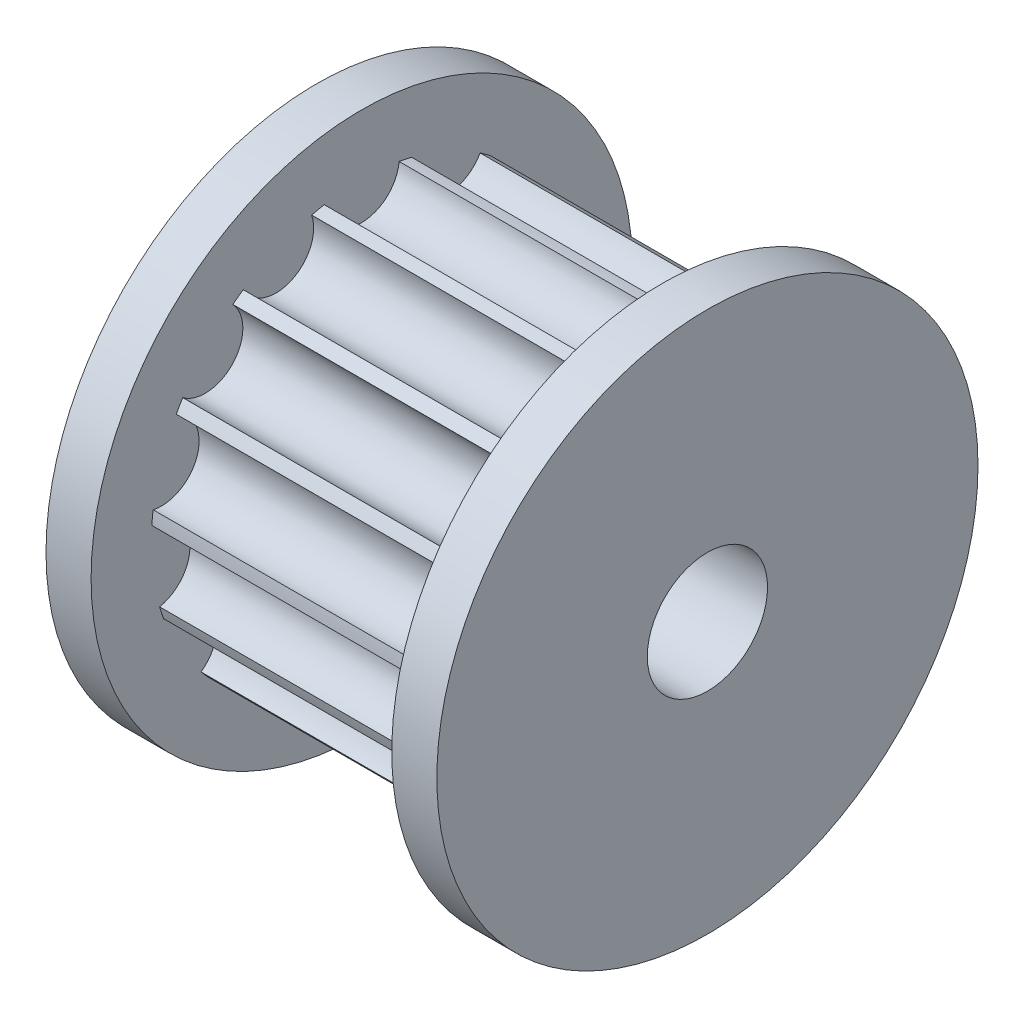
ISO-10303-21;
HEADER;
FILE_DESCRIPTION(('STEP AP214'),'2;1');
FILE_NAME('part.step','',(''),(''),'','','');
FILE_SCHEMA(('AUTOMOTIVE_DESIGN { 1 0 10303 214 1 1 1 1 }'));
ENDSEC;
DATA;
#1=APPLICATION_CONTEXT('core data for automotive mechanical design processes');
#2=APPLICATION_PROTOCOL_DEFINITION('international standard','automotive_design',2000,#1);
#3=PRODUCT_CONTEXT('',#1,'mechanical');
#4=PRODUCT('Part','Part','',(#3));
#5=PRODUCT_RELATED_PRODUCT_CATEGORY('part','',(#4));
#6=PRODUCT_DEFINITION_FORMATION('','',#4);
#7=PRODUCT_DEFINITION_CONTEXT('part definition',#1,'design');
#8=PRODUCT_DEFINITION('design','',#6,#7);
#9=PRODUCT_DEFINITION_SHAPE('','',#8);
#10=(LENGTH_UNIT() NAMED_UNIT(*) SI_UNIT(.MILLI.,.METRE.));
#11=(NAMED_UNIT(*) PLANE_ANGLE_UNIT() SI_UNIT($,.RADIAN.));
#12=(NAMED_UNIT(*) SI_UNIT($,.STERADIAN.) SOLID_ANGLE_UNIT());
#13=UNCERTAINTY_MEASURE_WITH_UNIT(LENGTH_MEASURE(1.E-05),#10,'distance_accuracy_value','');
#14=(GEOMETRIC_REPRESENTATION_CONTEXT(3) GLOBAL_UNCERTAINTY_ASSIGNED_CONTEXT((#13)) GLOBAL_UNIT_ASSIGNED_CONTEXT((#10,
#11,#12)) REPRESENTATION_CONTEXT('',''));
#15=CARTESIAN_POINT('',(0.,0.,0.));
#16=DIRECTION('',(0.,0.,1.));
#17=DIRECTION('',(1.,0.,0.));
#18=AXIS2_PLACEMENT_3D('',#15,#16,#17);
#19=CARTESIAN_POINT('',(-48.9644918561277,1.84719136614903,0.));
#20=DIRECTION('',(-1.,0.,0.));
#21=DIRECTION('',(0.,0.,1.));
#22=AXIS2_PLACEMENT_3D('',#19,#20,#21);
#23=CYLINDRICAL_SURFACE('',#22,7.);
#24=CARTESIAN_POINT('',(-27.3637349174757,1.84719136614903,0.));
#25=DIRECTION('',(-1.,0.,0.));
#26=DIRECTION('',(0.,0.,1.));
#27=AXIS2_PLACEMENT_3D('',#24,#25,#26);
#28=CIRCLE('',#27,7.);
#29=CARTESIAN_POINT('',(-27.3637349174757,-2.99383843144402,5.05612801448067));
#30=VERTEX_POINT('',#29);
#31=CARTESIAN_POINT('',(-27.3637349174757,-2.6752132446615,5.3430194212748));
#32=VERTEX_POINT('',#31);
#33=EDGE_CURVE('E316',#30,#32,#28,.T.);
#34=ORIENTED_EDGE('',*,*,#33,.F.);
#35=DIRECTION('',(-1.,0.,0.));
#36=VECTOR('',#35,1.);
#37=CARTESIAN_POINT('',(-10.3637349174757,-2.99383843144402,5.05612801448067));
#38=LINE('',#37,#36);
#39=CARTESIAN_POINT('',(-17.3637349174757,-2.99383843144402,5.05612801448067));
#40=VERTEX_POINT('',#39);
#41=EDGE_CURVE('E263',#40,#30,#38,.T.);
#42=ORIENTED_EDGE('',*,*,#41,.F.);
#43=CARTESIAN_POINT('',(-17.3637349174757,1.84719136614903,0.));
#44=DIRECTION('',(-1.,0.,0.));
#45=DIRECTION('',(0.,0.,1.));
#46=AXIS2_PLACEMENT_3D('',#43,#44,#45);
#47=CIRCLE('',#46,7.);
#48=CARTESIAN_POINT('',(-17.3637349174757,-2.6752132446615,5.3430194212748));
#49=VERTEX_POINT('',#48);
#50=EDGE_CURVE('E253',#40,#49,#47,.T.);
#51=ORIENTED_EDGE('',*,*,#50,.T.);
#52=DIRECTION('',(-1.,0.,0.));
#53=VECTOR('',#52,1.);
#54=CARTESIAN_POINT('',(-10.3637349174757,-2.6752132446615,5.3430194212748));
#55=LINE('',#54,#53);
#56=EDGE_CURVE('E486',#49,#32,#55,.T.);
#57=ORIENTED_EDGE('',*,*,#56,.T.);
#58=EDGE_LOOP('',(#34,#42,#51,#57));
#59=FACE_BOUND('',#58,.T.);
#60=ADVANCED_FACE('F39',(#59),#23,.T.);
#61=CARTESIAN_POINT('',(-17.3637349174757,-4.63182195132596,2.6499785719854));
#62=VERTEX_POINT('',#61);
#63=CARTESIAN_POINT('',(-17.3637349174757,-4.457432606977,3.04166345237019));
#64=VERTEX_POINT('',#63);
#65=EDGE_CURVE('E241',#62,#64,#47,.T.);
#66=ORIENTED_EDGE('',*,*,#65,.T.);
#67=DIRECTION('',(-1.,0.,0.));
#68=VECTOR('',#67,1.);
#69=CARTESIAN_POINT('',(-10.3637349174757,-4.457432606977,3.04166345237019));
#70=LINE('',#69,#68);
#71=CARTESIAN_POINT('',(-27.3637349174757,-4.457432606977,3.04166345237019));
#72=VERTEX_POINT('',#71);
#73=EDGE_CURVE('E245',#64,#72,#70,.T.);
#74=ORIENTED_EDGE('',*,*,#73,.T.);
#75=CARTESIAN_POINT('',(-27.3637349174757,-4.63182195132596,2.6499785719854));
#76=VERTEX_POINT('',#75);
#77=EDGE_CURVE('E320',#76,#72,#28,.T.);
#78=ORIENTED_EDGE('',*,*,#77,.F.);
#79=DIRECTION('',(-1.,0.,0.));
#80=VECTOR('',#79,1.);
#81=CARTESIAN_POINT('',(-10.3637349174757,-4.63182195132596,2.6499785719854));
#82=LINE('',#81,#80);
#83=EDGE_CURVE('E247',#62,#76,#82,.T.);
#84=ORIENTED_EDGE('',*,*,#83,.F.);
#85=EDGE_LOOP('',(#66,#74,#78,#84));
#86=FACE_BOUND('',#85,.T.);
#87=ADVANCED_FACE('F243',(#86),#23,.T.);
#88=CARTESIAN_POINT('',(-17.3637349174757,-5.14952520862831,-0.214376239905701));
#89=VERTEX_POINT('',#88);
#90=CARTESIAN_POINT('',(-17.3637349174757,-5.14952520862831,0.214376239905796));
#91=VERTEX_POINT('',#90);
#92=EDGE_CURVE('E252',#89,#91,#47,.T.);
#93=ORIENTED_EDGE('',*,*,#92,.T.);
#94=DIRECTION('',(-1.,0.,0.));
#95=VECTOR('',#94,1.);
#96=CARTESIAN_POINT('',(-10.3637349174757,-5.14952520862831,0.214376239905796));
#97=LINE('',#96,#95);
#98=CARTESIAN_POINT('',(-27.3637349174757,-5.14952520862831,0.214376239905795));
#99=VERTEX_POINT('',#98);
#100=EDGE_CURVE('E476',#91,#99,#97,.T.);
#101=ORIENTED_EDGE('',*,*,#100,.T.);
#102=CARTESIAN_POINT('',(-27.3637349174757,-5.14952520862831,-0.214376239905702));
#103=VERTEX_POINT('',#102);
#104=EDGE_CURVE('E324',#103,#99,#28,.T.);
#105=ORIENTED_EDGE('',*,*,#104,.F.);
#106=DIRECTION('',(-1.,0.,0.));
#107=VECTOR('',#106,1.);
#108=CARTESIAN_POINT('',(-10.3637349174757,-5.14952520862831,-0.214376239905701));
#109=LINE('',#108,#107);
#110=EDGE_CURVE('E463',#89,#103,#109,.T.);
#111=ORIENTED_EDGE('',*,*,#110,.F.);
#112=EDGE_LOOP('',(#93,#101,#105,#111));
#113=FACE_BOUND('',#112,.T.);
#114=ADVANCED_FACE('F467',(#113),#23,.T.);
#115=CARTESIAN_POINT('',(-17.3637349174757,-4.45743260697704,-3.04166345237011));
#116=VERTEX_POINT('',#115);
#117=CARTESIAN_POINT('',(-17.3637349174757,-4.631821951326,-2.64997857198531));
#118=VERTEX_POINT('',#117);
#119=EDGE_CURVE('E457',#116,#118,#47,.T.);
#120=ORIENTED_EDGE('',*,*,#119,.T.);
#121=DIRECTION('',(-1.,0.,0.));
#122=VECTOR('',#121,1.);
#123=CARTESIAN_POINT('',(-10.3637349174757,-4.631821951326,-2.64997857198531));
#124=LINE('',#123,#122);
#125=CARTESIAN_POINT('',(-27.3637349174757,-4.631821951326,-2.64997857198531));
#126=VERTEX_POINT('',#125);
#127=EDGE_CURVE('E465',#118,#126,#124,.T.);
#128=ORIENTED_EDGE('',*,*,#127,.T.);
#129=CARTESIAN_POINT('',(-27.3637349174757,-4.45743260697705,-3.04166345237011));
#130=VERTEX_POINT('',#129);
#131=EDGE_CURVE('E326',#130,#126,#28,.T.);
#132=ORIENTED_EDGE('',*,*,#131,.F.);
#133=DIRECTION('',(-1.,0.,0.));
#134=VECTOR('',#133,1.);
#135=CARTESIAN_POINT('',(-10.3637349174757,-4.45743260697704,-3.04166345237011));
#136=LINE('',#135,#134);
#137=EDGE_CURVE('E558',#116,#130,#136,.T.);
#138=ORIENTED_EDGE('',*,*,#137,.F.);
#139=EDGE_LOOP('',(#120,#128,#132,#138));
#140=FACE_BOUND('',#139,.T.);
#141=ADVANCED_FACE('F565',(#140),#23,.T.);
#142=CARTESIAN_POINT('',(-17.3637349174757,-2.67521324466158,-5.34301942127474));
#143=VERTEX_POINT('',#142);
#144=CARTESIAN_POINT('',(-17.3637349174757,-2.99383843144409,-5.0561280144806));
#145=VERTEX_POINT('',#144);
#146=EDGE_CURVE('E507',#143,#145,#47,.T.);
#147=ORIENTED_EDGE('',*,*,#146,.T.);
#148=DIRECTION('',(-1.,0.,0.));
#149=VECTOR('',#148,1.);
#150=CARTESIAN_POINT('',(-10.3637349174757,-2.99383843144409,-5.0561280144806));
#151=LINE('',#150,#149);
#152=CARTESIAN_POINT('',(-27.3637349174757,-2.99383843144409,-5.05612801448061));
#153=VERTEX_POINT('',#152);
#154=EDGE_CURVE('E393',#145,#153,#151,.T.);
#155=ORIENTED_EDGE('',*,*,#154,.T.);
#156=CARTESIAN_POINT('',(-27.3637349174757,-2.67521324466157,-5.34301942127474));
#157=VERTEX_POINT('',#156);
#158=EDGE_CURVE('E330',#157,#153,#28,.T.);
#159=ORIENTED_EDGE('',*,*,#158,.F.);
#160=DIRECTION('',(-1.,0.,0.));
#161=VECTOR('',#160,1.);
#162=CARTESIAN_POINT('',(-10.3637349174757,-2.67521324466158,-5.34301942127474));
#163=LINE('',#162,#161);
#164=EDGE_CURVE('E392',#143,#157,#163,.T.);
#165=ORIENTED_EDGE('',*,*,#164,.F.);
#166=EDGE_LOOP('',(#147,#155,#159,#165));
#167=FACE_BOUND('',#166,.T.);
#168=ADVANCED_FACE('F567',(#167),#23,.T.);
#169=CARTESIAN_POINT('',(-17.3637349174757,-0.111029040380856,-6.72051879243336));
#170=VERTEX_POINT('',#169);
#171=CARTESIAN_POINT('',(-17.3637349174757,-0.518796880183285,-6.5880269897912));
#172=VERTEX_POINT('',#171);
#173=EDGE_CURVE('E503',#170,#172,#47,.T.);
#174=ORIENTED_EDGE('',*,*,#173,.T.);
#175=DIRECTION('',(-1.,0.,0.));
#176=VECTOR('',#175,1.);
#177=CARTESIAN_POINT('',(-10.3637349174757,-0.518796880183285,-6.5880269897912));
#178=LINE('',#177,#176);
#179=CARTESIAN_POINT('',(-27.3637349174757,-0.518796880183285,-6.5880269897912));
#180=VERTEX_POINT('',#179);
#181=EDGE_CURVE('E382',#172,#180,#178,.T.);
#182=ORIENTED_EDGE('',*,*,#181,.T.);
#183=CARTESIAN_POINT('',(-27.3637349174757,-0.111029040380856,-6.72051879243336));
#184=VERTEX_POINT('',#183);
#185=EDGE_CURVE('E334',#184,#180,#28,.T.);
#186=ORIENTED_EDGE('',*,*,#185,.F.);
#187=DIRECTION('',(-1.,0.,0.));
#188=VECTOR('',#187,1.);
#189=CARTESIAN_POINT('',(-10.3637349174757,-0.111029040380856,-6.72051879243336));
#190=LINE('',#189,#188);
#191=EDGE_CURVE('E381',#170,#184,#190,.T.);
#192=ORIENTED_EDGE('',*,*,#191,.F.);
#193=EDGE_LOOP('',(#174,#182,#186,#192));
#194=FACE_BOUND('',#193,.T.);
#195=ADVANCED_FACE('F572',(#194),#23,.T.);
#196=CARTESIAN_POINT('',(-17.3637349174757,2.79174926206279,-6.93597941038373));
#197=VERTEX_POINT('',#196);
#198=CARTESIAN_POINT('',(-17.3637349174757,2.36534553319681,-6.98079624822061));
#199=VERTEX_POINT('',#198);
#200=EDGE_CURVE('E498',#197,#199,#47,.T.);
#201=ORIENTED_EDGE('',*,*,#200,.T.);
#202=DIRECTION('',(-1.,0.,0.));
#203=VECTOR('',#202,1.);
#204=CARTESIAN_POINT('',(-10.3637349174757,2.36534553319681,-6.98079624822061));
#205=LINE('',#204,#203);
#206=CARTESIAN_POINT('',(-27.3637349174757,2.36534553319681,-6.98079624822061));
#207=VERTEX_POINT('',#206);
#208=EDGE_CURVE('E363',#199,#207,#205,.T.);
#209=ORIENTED_EDGE('',*,*,#208,.T.);
#210=CARTESIAN_POINT('',(-27.3637349174757,2.79174926206279,-6.93597941038373));
#211=VERTEX_POINT('',#210);
#212=EDGE_CURVE('E338',#211,#207,#28,.T.);
#213=ORIENTED_EDGE('',*,*,#212,.F.);
#214=DIRECTION('',(-1.,0.,0.));
#215=VECTOR('',#214,1.);
#216=CARTESIAN_POINT('',(-10.3637349174757,2.79174926206279,-6.93597941038373));
#217=LINE('',#216,#215);
#218=EDGE_CURVE('E361',#197,#211,#217,.T.);
#219=ORIENTED_EDGE('',*,*,#218,.F.);
#220=EDGE_LOOP('',(#201,#209,#213,#219));
#221=FACE_BOUND('',#220,.T.);
#222=ADVANCED_FACE('F750',(#221),#23,.T.);
#223=CARTESIAN_POINT('',(-17.3637349174757,5.53120492326384,-5.95214617688395));
#224=VERTEX_POINT('',#223);
#225=CARTESIAN_POINT('',(-17.3637349174757,5.15989438381151,-6.1665224167897));
#226=VERTEX_POINT('',#225);
#227=EDGE_CURVE('E367',#224,#226,#47,.T.);
#228=ORIENTED_EDGE('',*,*,#227,.T.);
#229=DIRECTION('',(-1.,0.,0.));
#230=VECTOR('',#229,1.);
#231=CARTESIAN_POINT('',(-10.3637349174757,5.15989438381151,-6.1665224167897));
#232=LINE('',#231,#230);
#233=CARTESIAN_POINT('',(-27.3637349174757,5.15989438381152,-6.1665224167897));
#234=VERTEX_POINT('',#233);
#235=EDGE_CURVE('E358',#226,#234,#232,.T.);
#236=ORIENTED_EDGE('',*,*,#235,.T.);
#237=CARTESIAN_POINT('',(-27.3637349174757,5.53120492326385,-5.95214617688395));
#238=VERTEX_POINT('',#237);
#239=EDGE_CURVE('E299',#238,#234,#28,.T.);
#240=ORIENTED_EDGE('',*,*,#239,.F.);
#241=DIRECTION('',(-1.,0.,0.));
#242=VECTOR('',#241,1.);
#243=CARTESIAN_POINT('',(-10.3637349174757,5.53120492326384,-5.95214617688395));
#244=LINE('',#243,#242);
#245=EDGE_CURVE('E373',#224,#238,#244,.T.);
#246=ORIENTED_EDGE('',*,*,#245,.F.);
#247=EDGE_LOOP('',(#228,#236,#240,#246));
#248=FACE_BOUND('',#247,.T.);
#249=ADVANCED_FACE('F365',(#248),#23,.T.);
#250=CARTESIAN_POINT('',(-27.3637349174757,-0.518796880183193,6.58802698979124));
#251=VERTEX_POINT('',#250);
#252=CARTESIAN_POINT('',(-27.3637349174757,-0.111029040380764,6.72051879243339));
#253=VERTEX_POINT('',#252);
#254=EDGE_CURVE('E312',#251,#253,#28,.T.);
#255=ORIENTED_EDGE('',*,*,#254,.F.);
#256=DIRECTION('',(-1.,0.,0.));
#257=VECTOR('',#256,1.);
#258=CARTESIAN_POINT('',(-10.3637349174757,-0.518796880183194,6.58802698979124));
#259=LINE('',#258,#257);
#260=CARTESIAN_POINT('',(-17.3637349174757,-0.518796880183194,6.58802698979124));
#261=VERTEX_POINT('',#260);
#262=EDGE_CURVE('E697',#261,#251,#259,.T.);
#263=ORIENTED_EDGE('',*,*,#262,.F.);
#264=CARTESIAN_POINT('',(-17.3637349174757,-0.111029040380764,6.72051879243339));
#265=VERTEX_POINT('',#264);
#266=EDGE_CURVE('E523',#261,#265,#47,.T.);
#267=ORIENTED_EDGE('',*,*,#266,.T.);
#268=DIRECTION('',(-1.,0.,0.));
#269=VECTOR('',#268,1.);
#270=CARTESIAN_POINT('',(-10.3637349174757,-0.111029040380764,6.72051879243339));
#271=LINE('',#270,#269);
#272=EDGE_CURVE('E698',#265,#253,#271,.T.);
#273=ORIENTED_EDGE('',*,*,#272,.T.);
#274=EDGE_LOOP('',(#255,#263,#267,#273));
#275=FACE_BOUND('',#274,.T.);
#276=ADVANCED_FACE('F744',(#275),#23,.T.);
#277=CARTESIAN_POINT('',(-27.3637349174757,2.36534553319691,6.98079624822061));
#278=VERTEX_POINT('',#277);
#279=CARTESIAN_POINT('',(-27.3637349174757,2.79174926206288,6.93597941038371));
#280=VERTEX_POINT('',#279);
#281=EDGE_CURVE('E308',#278,#280,#28,.T.);
#282=ORIENTED_EDGE('',*,*,#281,.F.);
#283=DIRECTION('',(-1.,0.,0.));
#284=VECTOR('',#283,1.);
#285=CARTESIAN_POINT('',(-10.3637349174757,2.3653455331969,6.98079624822061));
#286=LINE('',#285,#284);
#287=CARTESIAN_POINT('',(-17.3637349174757,2.3653455331969,6.98079624822061));
#288=VERTEX_POINT('',#287);
#289=EDGE_CURVE('E708',#288,#278,#286,.T.);
#290=ORIENTED_EDGE('',*,*,#289,.F.);
#291=CARTESIAN_POINT('',(-17.3637349174757,2.79174926206288,6.93597941038371));
#292=VERTEX_POINT('',#291);
#293=EDGE_CURVE('E526',#288,#292,#47,.T.);
#294=ORIENTED_EDGE('',*,*,#293,.T.);
#295=DIRECTION('',(-1.,0.,0.));
#296=VECTOR('',#295,1.);
#297=CARTESIAN_POINT('',(-10.3637349174757,2.79174926206288,6.93597941038371));
#298=LINE('',#297,#296);
#299=EDGE_CURVE('E709',#292,#280,#298,.T.);
#300=ORIENTED_EDGE('',*,*,#299,.T.);
#301=EDGE_LOOP('',(#282,#290,#294,#300));
#302=FACE_BOUND('',#301,.T.);
#303=ADVANCED_FACE('F740',(#302),#23,.T.);
#304=CARTESIAN_POINT('',(-27.3637349174757,5.1598943838116,6.16652241678965));
#305=VERTEX_POINT('',#304);
#306=CARTESIAN_POINT('',(-27.3637349174757,5.53120492326393,5.9521461768839));
#307=VERTEX_POINT('',#306);
#308=EDGE_CURVE('E304',#305,#307,#28,.T.);
#309=ORIENTED_EDGE('',*,*,#308,.F.);
#310=DIRECTION('',(-1.,0.,0.));
#311=VECTOR('',#310,1.);
#312=CARTESIAN_POINT('',(-10.3637349174757,5.1598943838116,6.16652241678965));
#313=LINE('',#312,#311);
#314=CARTESIAN_POINT('',(-17.3637349174757,5.1598943838116,6.16652241678965));
#315=VERTEX_POINT('',#314);
#316=EDGE_CURVE('E719',#315,#305,#313,.T.);
#317=ORIENTED_EDGE('',*,*,#316,.F.);
#318=CARTESIAN_POINT('',(-17.3637349174757,5.53120492326393,5.9521461768839));
#319=VERTEX_POINT('',#318);
#320=EDGE_CURVE('E529',#315,#319,#47,.T.);
#321=ORIENTED_EDGE('',*,*,#320,.T.);
#322=DIRECTION('',(-1.,0.,0.));
#323=VECTOR('',#322,1.);
#324=CARTESIAN_POINT('',(-10.3637349174757,5.53120492326393,5.9521461768839));
#325=LINE('',#324,#323);
#326=EDGE_CURVE('E720',#319,#307,#325,.T.);
#327=ORIENTED_EDGE('',*,*,#326,.T.);
#328=EDGE_LOOP('',(#309,#317,#321,#327));
#329=FACE_BOUND('',#328,.T.);
#330=ADVANCED_FACE('F737',(#329),#23,.T.);
#331=CARTESIAN_POINT('',(-27.3637349174757,7.3816467877103,4.28600083839831));
#332=VERTEX_POINT('',#331);
#333=CARTESIAN_POINT('',(-27.3637349174757,7.63366117222732,3.9391327958504));
#334=VERTEX_POINT('',#333);
#335=EDGE_CURVE('E301',#332,#334,#28,.T.);
#336=ORIENTED_EDGE('',*,*,#335,.F.);
#337=DIRECTION('',(-1.,0.,0.));
#338=VECTOR('',#337,1.);
#339=CARTESIAN_POINT('',(-10.3637349174757,7.3816467877103,4.28600083839831));
#340=LINE('',#339,#338);
#341=CARTESIAN_POINT('',(-17.3637349174757,7.3816467877103,4.28600083839831));
#342=VERTEX_POINT('',#341);
#343=EDGE_CURVE('E540',#342,#332,#340,.T.);
#344=ORIENTED_EDGE('',*,*,#343,.F.);
#345=CARTESIAN_POINT('',(-17.3637349174757,7.63366117222732,3.9391327958504));
#346=VERTEX_POINT('',#345);
#347=EDGE_CURVE('E298',#342,#346,#47,.T.);
#348=ORIENTED_EDGE('',*,*,#347,.T.);
#349=DIRECTION('',(-1.,0.,0.));
#350=VECTOR('',#349,1.);
#351=CARTESIAN_POINT('',(-10.3637349174757,7.63366117222732,3.9391327958504));
#352=LINE('',#351,#350);
#353=EDGE_CURVE('E538',#346,#334,#352,.T.);
#354=ORIENTED_EDGE('',*,*,#353,.T.);
#355=EDGE_LOOP('',(#336,#344,#348,#354));
#356=FACE_BOUND('',#355,.T.);
#357=ADVANCED_FACE('F537',(#356),#23,.T.);
#358=CARTESIAN_POINT('',(-27.3637349174757,8.64644157027199,1.66439077795265));
#359=VERTEX_POINT('',#358);
#360=CARTESIAN_POINT('',(-27.3637349174757,8.73558422329188,1.24500756851646));
#361=VERTEX_POINT('',#360);
#362=EDGE_CURVE('E289',#359,#361,#28,.T.);
#363=ORIENTED_EDGE('',*,*,#362,.F.);
#364=DIRECTION('',(-1.,0.,0.));
#365=VECTOR('',#364,1.);
#366=CARTESIAN_POINT('',(-10.3637349174757,8.64644157027199,1.66439077795265));
#367=LINE('',#366,#365);
#368=CARTESIAN_POINT('',(-17.3637349174757,8.64644157027199,1.66439077795265));
#369=VERTEX_POINT('',#368);
#370=EDGE_CURVE('E544',#369,#359,#367,.T.);
#371=ORIENTED_EDGE('',*,*,#370,.F.);
#372=CARTESIAN_POINT('',(-17.3637349174757,8.73558422329188,1.24500756851646));
#373=VERTEX_POINT('',#372);
#374=EDGE_CURVE('E49',#369,#373,#47,.T.);
#375=ORIENTED_EDGE('',*,*,#374,.T.);
#376=DIRECTION('',(-1.,0.,0.));
#377=VECTOR('',#376,1.);
#378=CARTESIAN_POINT('',(-10.3637349174757,8.73558422329188,1.24500756851646));
#379=LINE('',#378,#377);
#380=EDGE_CURVE('E283',#373,#361,#379,.T.);
#381=ORIENTED_EDGE('',*,*,#380,.T.);
#382=EDGE_LOOP('',(#363,#371,#375,#381));
#383=FACE_BOUND('',#382,.T.);
#384=ADVANCED_FACE('F545',(#383),#23,.T.);
#385=CARTESIAN_POINT('',(-17.3637349174757,7.63366117222727,-3.93913279585048));
#386=VERTEX_POINT('',#385);
#387=CARTESIAN_POINT('',(-17.3637349174757,7.38164678771024,-4.28600083839838));
#388=VERTEX_POINT('',#387);
#389=EDGE_CURVE('E48',#386,#388,#47,.T.);
#390=ORIENTED_EDGE('',*,*,#389,.T.);
#391=DIRECTION('',(-1.,0.,0.));
#392=VECTOR('',#391,1.);
#393=CARTESIAN_POINT('',(-10.3637349174757,7.38164678771024,-4.28600083839838));
#394=LINE('',#393,#392);
#395=CARTESIAN_POINT('',(-27.3637349174757,7.38164678771024,-4.28600083839838));
#396=VERTEX_POINT('',#395);
#397=EDGE_CURVE('E404',#388,#396,#394,.T.);
#398=ORIENTED_EDGE('',*,*,#397,.T.);
#399=CARTESIAN_POINT('',(-27.3637349174757,7.63366117222727,-3.93913279585048));
#400=VERTEX_POINT('',#399);
#401=EDGE_CURVE('E292',#400,#396,#28,.T.);
#402=ORIENTED_EDGE('',*,*,#401,.F.);
#403=DIRECTION('',(-1.,0.,0.));
#404=VECTOR('',#403,1.);
#405=CARTESIAN_POINT('',(-10.3637349174757,7.63366117222727,-3.93913279585048));
#406=LINE('',#405,#404);
#407=EDGE_CURVE('E403',#386,#400,#406,.T.);
#408=ORIENTED_EDGE('',*,*,#407,.F.);
#409=EDGE_LOOP('',(#390,#398,#402,#408));
#410=FACE_BOUND('',#409,.T.);
#411=ADVANCED_FACE('F581',(#410),#23,.T.);
#412=CARTESIAN_POINT('',(-17.3637349174757,8.73558422329188,-1.24500756851646));
#413=VERTEX_POINT('',#412);
#414=CARTESIAN_POINT('',(-17.3637349174757,8.64644157027197,-1.66439077795274));
#415=VERTEX_POINT('',#414);
#416=EDGE_CURVE('E11',#413,#415,#47,.T.);
#417=ORIENTED_EDGE('',*,*,#416,.T.);
#418=DIRECTION('',(-1.,0.,0.));
#419=VECTOR('',#418,1.);
#420=CARTESIAN_POINT('',(-10.3637349174757,8.64644157027197,-1.66439077795274));
#421=LINE('',#420,#419);
#422=CARTESIAN_POINT('',(-27.3637349174757,8.64644157027197,-1.66439077795274));
#423=VERTEX_POINT('',#422);
#424=EDGE_CURVE('E405',#415,#423,#421,.T.);
#425=ORIENTED_EDGE('',*,*,#424,.T.);
#426=CARTESIAN_POINT('',(-27.3637349174757,8.73558422329188,-1.24500756851646));
#427=VERTEX_POINT('',#426);
#428=EDGE_CURVE('E290',#427,#423,#28,.T.);
#429=ORIENTED_EDGE('',*,*,#428,.F.);
#430=DIRECTION('',(-1.,0.,0.));
#431=VECTOR('',#430,1.);
#432=CARTESIAN_POINT('',(-10.3637349174757,8.73558422329188,-1.24500756851646));
#433=LINE('',#432,#431);
#434=EDGE_CURVE('E277',#413,#427,#433,.T.);
#435=ORIENTED_EDGE('',*,*,#434,.F.);
#436=EDGE_LOOP('',(#417,#425,#429,#435));
#437=FACE_BOUND('',#436,.T.);
#438=ADVANCED_FACE('F41',(#437),#23,.T.);
#439=CARTESIAN_POINT('',(-11.6137349174757,1.84719136614903,0.));
#440=DIRECTION('',(-1.,0.,0.));
#441=DIRECTION('',(0.,0.,1.));
#442=AXIS2_PLACEMENT_3D('',#439,#440,#441);
#443=CYLINDRICAL_SURFACE('',#442,2.);
#444=CARTESIAN_POINT('',(-28.8637349174757,1.84719136614903,0.));
#445=DIRECTION('',(-1.,0.,0.));
#446=DIRECTION('',(0.,0.,1.));
#447=AXIS2_PLACEMENT_3D('',#444,#445,#446);
#448=CIRCLE('',#447,2.);
#449=CARTESIAN_POINT('',(-28.8637349174757,1.84719136614903,2.));
#450=VERTEX_POINT('',#449);
#451=EDGE_CURVE('E682',#450,#450,#448,.T.);
#452=ORIENTED_EDGE('',*,*,#451,.T.);
#453=EDGE_LOOP('',(#452));
#454=FACE_BOUND('',#453,.T.);
#455=CARTESIAN_POINT('',(-15.8637349174757,1.84719136614903,0.));
#456=DIRECTION('',(1.,0.,0.));
#457=DIRECTION('',(0.,0.,-1.));
#458=AXIS2_PLACEMENT_3D('',#455,#456,#457);
#459=CIRCLE('',#458,2.);
#460=CARTESIAN_POINT('',(-15.8637349174757,1.84719136614903,-2.));
#461=VERTEX_POINT('',#460);
#462=EDGE_CURVE('E672',#461,#461,#459,.T.);
#463=ORIENTED_EDGE('',*,*,#462,.T.);
#464=EDGE_LOOP('',(#463));
#465=FACE_BOUND('',#464,.T.);
#466=ADVANCED_FACE('F580',(#454,#465),#443,.F.);
#467=CARTESIAN_POINT('',(-10.3637349174757,8.84719136614902,0.));
#468=DIRECTION('',(-1.,0.,0.));
#469=DIRECTION('',(0.,0.,1.));
#470=AXIS2_PLACEMENT_3D('',#467,#468,#469);
#471=CYLINDRICAL_SURFACE('',#470,1.25);
#472=ORIENTED_EDGE('',*,*,#434,.T.);
#473=CARTESIAN_POINT('',(-27.3637349174757,8.84719136614902,0.));
#474=DIRECTION('',(-1.,0.,0.));
#475=DIRECTION('',(0.,0.,1.));
#476=AXIS2_PLACEMENT_3D('',#473,#474,#475);
#477=CIRCLE('',#476,1.25);
#478=EDGE_CURVE('E271',#427,#361,#477,.T.);
#479=ORIENTED_EDGE('',*,*,#478,.T.);
#480=ORIENTED_EDGE('',*,*,#380,.F.);
#481=CARTESIAN_POINT('',(-17.3637349174757,8.84719136614902,0.));
#482=DIRECTION('',(-1.,0.,0.));
#483=DIRECTION('',(0.,0.,1.));
#484=AXIS2_PLACEMENT_3D('',#481,#482,#483);
#485=CIRCLE('',#484,1.25);
#486=EDGE_CURVE('E62',#413,#373,#485,.T.);
#487=ORIENTED_EDGE('',*,*,#486,.F.);
#488=EDGE_LOOP('',(#472,#479,#480,#487));
#489=FACE_BOUND('',#488,.T.);
#490=ADVANCED_FACE('F588',(#489),#471,.F.);
#491=CARTESIAN_POINT('',(-10.3637349174757,8.24200956964723,-2.84715650153061));
#492=DIRECTION('',(-1.,0.,0.));
#493=DIRECTION('',(0.,0.,1.));
#494=AXIS2_PLACEMENT_3D('',#491,#492,#493);
#495=CYLINDRICAL_SURFACE('',#494,1.25);
#496=ORIENTED_EDGE('',*,*,#407,.T.);
#497=CARTESIAN_POINT('',(-27.3637349174757,8.24200956964723,-2.84715650153061));
#498=DIRECTION('',(-1.,0.,0.));
#499=DIRECTION('',(0.,0.406736643075801,0.913545457642601));
#500=AXIS2_PLACEMENT_3D('',#497,#498,#499);
#501=CIRCLE('',#500,1.25);
#502=EDGE_CURVE('E400',#400,#423,#501,.T.);
#503=ORIENTED_EDGE('',*,*,#502,.T.);
#504=ORIENTED_EDGE('',*,*,#424,.F.);
#505=CARTESIAN_POINT('',(-17.3637349174757,8.24200956964723,-2.84715650153061));
#506=DIRECTION('',(-1.,0.,0.));
#507=DIRECTION('',(0.,0.,1.));
#508=AXIS2_PLACEMENT_3D('',#505,#506,#507);
#509=CIRCLE('',#508,1.25);
#510=EDGE_CURVE('E409',#386,#415,#509,.T.);
#511=ORIENTED_EDGE('',*,*,#510,.F.);
#512=EDGE_LOOP('',(#496,#503,#504,#511));
#513=FACE_BOUND('',#512,.T.);
#514=ADVANCED_FACE('F594',(#513),#495,.F.);
#515=CARTESIAN_POINT('',(-10.3637349174757,8.24200956964727,2.84715650153052));
#516=DIRECTION('',(-1.,0.,0.));
#517=DIRECTION('',(0.,0.,1.));
#518=AXIS2_PLACEMENT_3D('',#515,#516,#517);
#519=CYLINDRICAL_SURFACE('',#518,1.25);
#520=ORIENTED_EDGE('',*,*,#370,.T.);
#521=CARTESIAN_POINT('',(-27.3637349174757,8.24200956964727,2.84715650153052));
#522=DIRECTION('',(-1.,0.,0.));
#523=DIRECTION('',(0.,-0.406736643075789,0.913545457642606));
#524=AXIS2_PLACEMENT_3D('',#521,#522,#523);
#525=CIRCLE('',#524,1.25);
#526=EDGE_CURVE('E547',#359,#334,#525,.T.);
#527=ORIENTED_EDGE('',*,*,#526,.T.);
#528=ORIENTED_EDGE('',*,*,#353,.F.);
#529=CARTESIAN_POINT('',(-17.3637349174757,8.24200956964727,2.84715650153052));
#530=DIRECTION('',(-1.,0.,0.));
#531=DIRECTION('',(0.,0.,1.));
#532=AXIS2_PLACEMENT_3D('',#529,#530,#531);
#533=CIRCLE('',#532,1.25);
#534=EDGE_CURVE('E416',#369,#346,#533,.T.);
#535=ORIENTED_EDGE('',*,*,#534,.F.);
#536=EDGE_LOOP('',(#520,#527,#528,#535));
#537=FACE_BOUND('',#536,.T.);
#538=ADVANCED_FACE('F543',(#537),#519,.F.);
#539=CARTESIAN_POINT('',(-10.3637349174757,6.5311056106611,5.2020137783417));
#540=DIRECTION('',(-1.,0.,0.));
#541=DIRECTION('',(0.,0.,1.));
#542=AXIS2_PLACEMENT_3D('',#539,#540,#541);
#543=CYLINDRICAL_SURFACE('',#542,1.25);
#544=ORIENTED_EDGE('',*,*,#343,.T.);
#545=CARTESIAN_POINT('',(-27.3637349174757,6.5311056106611,5.2020137783417));
#546=DIRECTION('',(-1.,0.,0.));
#547=DIRECTION('',(0.,-0.743144825477386,0.669130606358867));
#548=AXIS2_PLACEMENT_3D('',#545,#546,#547);
#549=CIRCLE('',#548,1.25);
#550=EDGE_CURVE('E551',#332,#307,#549,.T.);
#551=ORIENTED_EDGE('',*,*,#550,.T.);
#552=ORIENTED_EDGE('',*,*,#326,.F.);
#553=CARTESIAN_POINT('',(-17.3637349174757,6.5311056106611,5.2020137783417));
#554=DIRECTION('',(-1.,0.,0.));
#555=DIRECTION('',(0.,0.,1.));
#556=AXIS2_PLACEMENT_3D('',#553,#554,#555);
#557=CIRCLE('',#556,1.25);
#558=EDGE_CURVE('E420',#342,#319,#557,.T.);
#559=ORIENTED_EDGE('',*,*,#558,.F.);
#560=EDGE_LOOP('',(#544,#551,#552,#559));
#561=FACE_BOUND('',#560,.T.);
#562=ADVANCED_FACE('F602',(#561),#543,.F.);
#563=CARTESIAN_POINT('',(-10.3637349174757,4.01031032677373,6.65739561406605));
#564=DIRECTION('',(-1.,0.,0.));
#565=DIRECTION('',(0.,0.,1.));
#566=AXIS2_PLACEMENT_3D('',#563,#564,#565);
#567=CYLINDRICAL_SURFACE('',#566,1.25);
#568=ORIENTED_EDGE('',*,*,#316,.T.);
#569=CARTESIAN_POINT('',(-27.3637349174757,4.01031032677373,6.65739561406605));
#570=DIRECTION('',(-1.,0.,0.));
#571=DIRECTION('',(0.,-0.95105651629515,0.309016994374957));
#572=AXIS2_PLACEMENT_3D('',#569,#570,#571);
#573=CIRCLE('',#572,1.25);
#574=EDGE_CURVE('E716',#305,#280,#573,.T.);
#575=ORIENTED_EDGE('',*,*,#574,.T.);
#576=ORIENTED_EDGE('',*,*,#299,.F.);
#577=CARTESIAN_POINT('',(-17.3637349174757,4.01031032677373,6.65739561406605));
#578=DIRECTION('',(-1.,0.,0.));
#579=DIRECTION('',(0.,0.,1.));
#580=AXIS2_PLACEMENT_3D('',#577,#578,#579);
#581=CIRCLE('',#580,1.25);
#582=EDGE_CURVE('E424',#315,#292,#581,.T.);
#583=ORIENTED_EDGE('',*,*,#582,.F.);
#584=EDGE_LOOP('',(#568,#575,#576,#583));
#585=FACE_BOUND('',#584,.T.);
#586=ADVANCED_FACE('F631',(#585),#567,.F.);
#587=CARTESIAN_POINT('',(-10.3637349174757,1.11549212327552,6.96165326757792));
#588=DIRECTION('',(-1.,0.,0.));
#589=DIRECTION('',(0.,0.,1.));
#590=AXIS2_PLACEMENT_3D('',#587,#588,#589);
#591=CYLINDRICAL_SURFACE('',#590,1.25);
#592=ORIENTED_EDGE('',*,*,#289,.T.);
#593=CARTESIAN_POINT('',(-27.3637349174757,1.11549212327552,6.96165326757792));
#594=DIRECTION('',(-1.,0.,0.));
#595=DIRECTION('',(0.,-0.994521895368274,-0.104528463267644));
#596=AXIS2_PLACEMENT_3D('',#593,#594,#595);
#597=CIRCLE('',#596,1.25);
#598=EDGE_CURVE('E705',#278,#253,#597,.T.);
#599=ORIENTED_EDGE('',*,*,#598,.T.);
#600=ORIENTED_EDGE('',*,*,#272,.F.);
#601=CARTESIAN_POINT('',(-17.3637349174757,1.11549212327552,6.96165326757792));
#602=DIRECTION('',(-1.,0.,0.));
#603=DIRECTION('',(0.,0.,1.));
#604=AXIS2_PLACEMENT_3D('',#601,#602,#603);
#605=CIRCLE('',#604,1.25);
#606=EDGE_CURVE('E428',#288,#265,#605,.T.);
#607=ORIENTED_EDGE('',*,*,#606,.F.);
#608=EDGE_LOOP('',(#592,#599,#600,#607));
#609=FACE_BOUND('',#608,.T.);
#610=ADVANCED_FACE('F635',(#609),#591,.F.);
#611=CARTESIAN_POINT('',(-10.3637349174757,-1.65280863385092,6.0621778264911));
#612=DIRECTION('',(-1.,0.,0.));
#613=DIRECTION('',(0.,0.,1.));
#614=AXIS2_PLACEMENT_3D('',#611,#612,#613);
#615=CYLINDRICAL_SURFACE('',#614,1.25);
#616=ORIENTED_EDGE('',*,*,#262,.T.);
#617=CARTESIAN_POINT('',(-27.3637349174757,-1.65280863385092,6.0621778264911));
#618=DIRECTION('',(-1.,0.,0.));
#619=DIRECTION('',(0.,-0.866025403784443,-0.499999999999992));
#620=AXIS2_PLACEMENT_3D('',#617,#618,#619);
#621=CIRCLE('',#620,1.25);
#622=EDGE_CURVE('E694',#251,#32,#621,.T.);
#623=ORIENTED_EDGE('',*,*,#622,.T.);
#624=ORIENTED_EDGE('',*,*,#56,.F.);
#625=CARTESIAN_POINT('',(-17.3637349174757,-1.65280863385092,6.0621778264911));
#626=DIRECTION('',(-1.,0.,0.));
#627=DIRECTION('',(0.,0.,1.));
#628=AXIS2_PLACEMENT_3D('',#625,#626,#627);
#629=CIRCLE('',#628,1.25);
#630=EDGE_CURVE('E432',#261,#49,#629,.T.);
#631=ORIENTED_EDGE('',*,*,#630,.F.);
#632=EDGE_LOOP('',(#616,#623,#624,#631));
#633=FACE_BOUND('',#632,.T.);
#634=ADVANCED_FACE('F618',(#633),#615,.F.);
#635=CARTESIAN_POINT('',(-10.3637349174757,6.53110561066102,-5.20201377834177));
#636=DIRECTION('',(-1.,0.,0.));
#637=DIRECTION('',(0.,0.,1.));
#638=AXIS2_PLACEMENT_3D('',#635,#636,#637);
#639=CYLINDRICAL_SURFACE('',#638,1.25);
#640=ORIENTED_EDGE('',*,*,#245,.T.);
#641=CARTESIAN_POINT('',(-27.3637349174757,6.53110561066102,-5.20201377834177));
#642=DIRECTION('',(-1.,0.,0.));
#643=DIRECTION('',(0.,0.743144825477395,0.669130606358857));
#644=AXIS2_PLACEMENT_3D('',#641,#642,#643);
#645=CIRCLE('',#644,1.25);
#646=EDGE_CURVE('E351',#238,#396,#645,.T.);
#647=ORIENTED_EDGE('',*,*,#646,.T.);
#648=ORIENTED_EDGE('',*,*,#397,.F.);
#649=CARTESIAN_POINT('',(-17.3637349174757,6.53110561066102,-5.20201377834177));
#650=DIRECTION('',(-1.,0.,0.));
#651=DIRECTION('',(0.,0.,1.));
#652=AXIS2_PLACEMENT_3D('',#649,#650,#651);
#653=CIRCLE('',#652,1.25);
#654=EDGE_CURVE('E435',#224,#388,#653,.T.);
#655=ORIENTED_EDGE('',*,*,#654,.F.);
#656=EDGE_LOOP('',(#640,#647,#648,#655));
#657=FACE_BOUND('',#656,.T.);
#658=ADVANCED_FACE('F494',(#657),#639,.F.);
#659=CARTESIAN_POINT('',(-10.3637349174757,4.01031032677364,-6.65739561406608));
#660=DIRECTION('',(-1.,0.,0.));
#661=DIRECTION('',(0.,0.,1.));
#662=AXIS2_PLACEMENT_3D('',#659,#660,#661);
#663=CYLINDRICAL_SURFACE('',#662,1.25);
#664=ORIENTED_EDGE('',*,*,#218,.T.);
#665=CARTESIAN_POINT('',(-27.3637349174757,4.01031032677364,-6.65739561406608));
#666=DIRECTION('',(-1.,0.,0.));
#667=DIRECTION('',(0.,0.951056516295154,0.309016994374945));
#668=AXIS2_PLACEMENT_3D('',#665,#666,#667);
#669=CIRCLE('',#668,1.25);
#670=EDGE_CURVE('E348',#211,#234,#669,.T.);
#671=ORIENTED_EDGE('',*,*,#670,.T.);
#672=ORIENTED_EDGE('',*,*,#235,.F.);
#673=CARTESIAN_POINT('',(-17.3637349174757,4.01031032677364,-6.65739561406608));
#674=DIRECTION('',(-1.,0.,0.));
#675=DIRECTION('',(0.,0.,1.));
#676=AXIS2_PLACEMENT_3D('',#673,#674,#675);
#677=CIRCLE('',#676,1.25);
#678=EDGE_CURVE('E438',#197,#226,#677,.T.);
#679=ORIENTED_EDGE('',*,*,#678,.F.);
#680=EDGE_LOOP('',(#664,#671,#672,#679));
#681=FACE_BOUND('',#680,.T.);
#682=ADVANCED_FACE('F357',(#681),#663,.F.);
#683=CARTESIAN_POINT('',(-10.3637349174757,1.11549212327543,-6.96165326757791));
#684=DIRECTION('',(-1.,0.,0.));
#685=DIRECTION('',(0.,0.,1.));
#686=AXIS2_PLACEMENT_3D('',#683,#684,#685);
#687=CYLINDRICAL_SURFACE('',#686,1.25);
#688=ORIENTED_EDGE('',*,*,#191,.T.);
#689=CARTESIAN_POINT('',(-27.3637349174757,1.11549212327543,-6.96165326757791));
#690=DIRECTION('',(-1.,0.,0.));
#691=DIRECTION('',(0.,0.994521895368273,-0.104528463267657));
#692=AXIS2_PLACEMENT_3D('',#689,#690,#691);
#693=CIRCLE('',#692,1.25);
#694=EDGE_CURVE('E378',#184,#207,#693,.T.);
#695=ORIENTED_EDGE('',*,*,#694,.T.);
#696=ORIENTED_EDGE('',*,*,#208,.F.);
#697=CARTESIAN_POINT('',(-17.3637349174757,1.11549212327543,-6.96165326757791));
#698=DIRECTION('',(-1.,0.,0.));
#699=DIRECTION('',(0.,0.,1.));
#700=AXIS2_PLACEMENT_3D('',#697,#698,#699);
#701=CIRCLE('',#700,1.25);
#702=EDGE_CURVE('E441',#170,#199,#701,.T.);
#703=ORIENTED_EDGE('',*,*,#702,.F.);
#704=EDGE_LOOP('',(#688,#695,#696,#703));
#705=FACE_BOUND('',#704,.T.);
#706=ADVANCED_FACE('F609',(#705),#687,.F.);
#707=CARTESIAN_POINT('',(-10.3637349174757,-1.652808633851,-6.06217782649105));
#708=DIRECTION('',(-1.,0.,0.));
#709=DIRECTION('',(0.,0.,1.));
#710=AXIS2_PLACEMENT_3D('',#707,#708,#709);
#711=CYLINDRICAL_SURFACE('',#710,1.25);
#712=ORIENTED_EDGE('',*,*,#164,.T.);
#713=CARTESIAN_POINT('',(-27.3637349174757,-1.652808633851,-6.06217782649105));
#714=DIRECTION('',(-1.,0.,0.));
#715=DIRECTION('',(0.,0.866025403784436,-0.500000000000004));
#716=AXIS2_PLACEMENT_3D('',#713,#714,#715);
#717=CIRCLE('',#716,1.25);
#718=EDGE_CURVE('E389',#157,#180,#717,.T.);
#719=ORIENTED_EDGE('',*,*,#718,.T.);
#720=ORIENTED_EDGE('',*,*,#181,.F.);
#721=CARTESIAN_POINT('',(-17.3637349174757,-1.652808633851,-6.06217782649105));
#722=DIRECTION('',(-1.,0.,0.));
#723=DIRECTION('',(0.,0.,1.));
#724=AXIS2_PLACEMENT_3D('',#721,#722,#723);
#725=CIRCLE('',#724,1.25);
#726=EDGE_CURVE('E445',#143,#172,#725,.T.);
#727=ORIENTED_EDGE('',*,*,#726,.F.);
#728=EDGE_LOOP('',(#712,#719,#720,#727));
#729=FACE_BOUND('',#728,.T.);
#730=ADVANCED_FACE('F606',(#729),#711,.F.);
#731=CARTESIAN_POINT('',(-10.3637349174757,-3.81592759447563,-4.11449676604728));
#732=DIRECTION('',(-1.,0.,0.));
#733=DIRECTION('',(0.,0.,1.));
#734=AXIS2_PLACEMENT_3D('',#731,#732,#733);
#735=CYLINDRICAL_SURFACE('',#734,1.25);
#736=ORIENTED_EDGE('',*,*,#137,.T.);
#737=CARTESIAN_POINT('',(-27.3637349174757,-3.81592759447563,-4.11449676604728));
#738=DIRECTION('',(-1.,0.,0.));
#739=DIRECTION('',(0.,0.587785252292469,-0.80901699437495));
#740=AXIS2_PLACEMENT_3D('',#737,#738,#739);
#741=CIRCLE('',#740,1.25);
#742=EDGE_CURVE('E474',#130,#153,#741,.T.);
#743=ORIENTED_EDGE('',*,*,#742,.T.);
#744=ORIENTED_EDGE('',*,*,#154,.F.);
#745=CARTESIAN_POINT('',(-17.3637349174757,-3.81592759447563,-4.11449676604728));
#746=DIRECTION('',(-1.,0.,0.));
#747=DIRECTION('',(0.,0.,1.));
#748=AXIS2_PLACEMENT_3D('',#745,#746,#747);
#749=CIRCLE('',#748,1.25);
#750=EDGE_CURVE('E449',#116,#145,#749,.T.);
#751=ORIENTED_EDGE('',*,*,#750,.F.);
#752=EDGE_LOOP('',(#736,#743,#744,#751));
#753=FACE_BOUND('',#752,.T.);
#754=ADVANCED_FACE('F564',(#753),#735,.F.);
#755=CARTESIAN_POINT('',(-10.3637349174757,-4.99984183898762,-1.45538183572427));
#756=DIRECTION('',(-1.,0.,0.));
#757=DIRECTION('',(0.,0.,1.));
#758=AXIS2_PLACEMENT_3D('',#755,#756,#757);
#759=CYLINDRICAL_SURFACE('',#758,1.25);
#760=ORIENTED_EDGE('',*,*,#110,.T.);
#761=CARTESIAN_POINT('',(-27.3637349174757,-4.99984183898762,-1.45538183572427));
#762=DIRECTION('',(-1.,0.,0.));
#763=DIRECTION('',(0.,0.207911690817753,-0.978147600733807));
#764=AXIS2_PLACEMENT_3D('',#761,#762,#763);
#765=CIRCLE('',#764,1.25);
#766=EDGE_CURVE('E470',#103,#126,#765,.T.);
#767=ORIENTED_EDGE('',*,*,#766,.T.);
#768=ORIENTED_EDGE('',*,*,#127,.F.);
#769=CARTESIAN_POINT('',(-17.3637349174757,-4.99984183898762,-1.45538183572427));
#770=DIRECTION('',(-1.,0.,0.));
#771=DIRECTION('',(0.,0.,1.));
#772=AXIS2_PLACEMENT_3D('',#769,#770,#771);
#773=CIRCLE('',#772,1.25);
#774=EDGE_CURVE('E279',#89,#118,#773,.T.);
#775=ORIENTED_EDGE('',*,*,#774,.F.);
#776=EDGE_LOOP('',(#760,#767,#768,#775));
#777=FACE_BOUND('',#776,.T.);
#778=ADVANCED_FACE('F462',(#777),#759,.F.);
#779=CARTESIAN_POINT('',(-10.3637349174757,-4.9998418389876,1.45538183572436));
#780=DIRECTION('',(-1.,0.,0.));
#781=DIRECTION('',(0.,0.,1.));
#782=AXIS2_PLACEMENT_3D('',#779,#780,#781);
#783=CYLINDRICAL_SURFACE('',#782,1.25);
#784=ORIENTED_EDGE('',*,*,#83,.T.);
#785=CARTESIAN_POINT('',(-27.3637349174757,-4.9998418389876,1.45538183572436));
#786=DIRECTION('',(-1.,0.,0.));
#787=DIRECTION('',(0.,-0.207911690817766,-0.978147600733804));
#788=AXIS2_PLACEMENT_3D('',#785,#786,#787);
#789=CIRCLE('',#788,1.25);
#790=EDGE_CURVE('E262',#76,#99,#789,.T.);
#791=ORIENTED_EDGE('',*,*,#790,.T.);
#792=ORIENTED_EDGE('',*,*,#100,.F.);
#793=CARTESIAN_POINT('',(-17.3637349174757,-4.9998418389876,1.45538183572436));
#794=DIRECTION('',(-1.,0.,0.));
#795=DIRECTION('',(0.,0.,1.));
#796=AXIS2_PLACEMENT_3D('',#793,#794,#795);
#797=CIRCLE('',#796,1.25);
#798=EDGE_CURVE('E272',#62,#91,#797,.T.);
#799=ORIENTED_EDGE('',*,*,#798,.F.);
#800=EDGE_LOOP('',(#784,#791,#792,#799));
#801=FACE_BOUND('',#800,.T.);
#802=ADVANCED_FACE('F621',(#801),#783,.F.);
#803=CARTESIAN_POINT('',(-10.3637349174757,-3.81592759447557,4.11449676604736));
#804=DIRECTION('',(-1.,0.,0.));
#805=DIRECTION('',(0.,0.,1.));
#806=AXIS2_PLACEMENT_3D('',#803,#804,#805);
#807=CYLINDRICAL_SURFACE('',#806,1.25);
#808=ORIENTED_EDGE('',*,*,#41,.T.);
#809=CARTESIAN_POINT('',(-27.3637349174757,-3.81592759447557,4.11449676604736));
#810=DIRECTION('',(-1.,0.,0.));
#811=DIRECTION('',(0.,-0.58778525229248,-0.809016994374943));
#812=AXIS2_PLACEMENT_3D('',#809,#810,#811);
#813=CIRCLE('',#812,1.25);
#814=EDGE_CURVE('E260',#30,#72,#813,.T.);
#815=ORIENTED_EDGE('',*,*,#814,.T.);
#816=ORIENTED_EDGE('',*,*,#73,.F.);
#817=CARTESIAN_POINT('',(-17.3637349174757,-3.81592759447557,4.11449676604736));
#818=DIRECTION('',(-1.,0.,0.));
#819=DIRECTION('',(0.,0.,1.));
#820=AXIS2_PLACEMENT_3D('',#817,#818,#819);
#821=CIRCLE('',#820,1.25);
#822=EDGE_CURVE('E258',#40,#64,#821,.T.);
#823=ORIENTED_EDGE('',*,*,#822,.F.);
#824=EDGE_LOOP('',(#808,#815,#816,#823));
#825=FACE_BOUND('',#824,.T.);
#826=ADVANCED_FACE('F257',(#825),#807,.F.);
#827=CARTESIAN_POINT('',(-27.3637349174757,1.84719136614903,0.));
#828=DIRECTION('',(-1.,0.,0.));
#829=DIRECTION('',(0.,0.,1.));
#830=AXIS2_PLACEMENT_3D('',#827,#828,#829);
#831=PLANE('',#830);
#832=CARTESIAN_POINT('',(-27.3637349174757,1.84719136614903,0.));
#833=DIRECTION('',(-1.,0.,0.));
#834=DIRECTION('',(0.,0.,1.));
#835=AXIS2_PLACEMENT_3D('',#832,#833,#834);
#836=CIRCLE('',#835,9.);
#837=CARTESIAN_POINT('',(-27.3637349174757,1.84719136614903,9.));
#838=VERTEX_POINT('',#837);
#839=EDGE_CURVE('E687',#838,#838,#836,.T.);
#840=ORIENTED_EDGE('',*,*,#839,.F.);
#841=EDGE_LOOP('',(#840));
#842=FACE_BOUND('',#841,.T.);
#843=ORIENTED_EDGE('',*,*,#502,.F.);
#844=ORIENTED_EDGE('',*,*,#401,.T.);
#845=ORIENTED_EDGE('',*,*,#646,.F.);
#846=ORIENTED_EDGE('',*,*,#239,.T.);
#847=ORIENTED_EDGE('',*,*,#670,.F.);
#848=ORIENTED_EDGE('',*,*,#212,.T.);
#849=ORIENTED_EDGE('',*,*,#694,.F.);
#850=ORIENTED_EDGE('',*,*,#185,.T.);
#851=ORIENTED_EDGE('',*,*,#718,.F.);
#852=ORIENTED_EDGE('',*,*,#158,.T.);
#853=ORIENTED_EDGE('',*,*,#742,.F.);
#854=ORIENTED_EDGE('',*,*,#131,.T.);
#855=ORIENTED_EDGE('',*,*,#766,.F.);
#856=ORIENTED_EDGE('',*,*,#104,.T.);
#857=ORIENTED_EDGE('',*,*,#790,.F.);
#858=ORIENTED_EDGE('',*,*,#77,.T.);
#859=ORIENTED_EDGE('',*,*,#814,.F.);
#860=ORIENTED_EDGE('',*,*,#33,.T.);
#861=ORIENTED_EDGE('',*,*,#622,.F.);
#862=ORIENTED_EDGE('',*,*,#254,.T.);
#863=ORIENTED_EDGE('',*,*,#598,.F.);
#864=ORIENTED_EDGE('',*,*,#281,.T.);
#865=ORIENTED_EDGE('',*,*,#574,.F.);
#866=ORIENTED_EDGE('',*,*,#308,.T.);
#867=ORIENTED_EDGE('',*,*,#550,.F.);
#868=ORIENTED_EDGE('',*,*,#335,.T.);
#869=ORIENTED_EDGE('',*,*,#526,.F.);
#870=ORIENTED_EDGE('',*,*,#362,.T.);
#871=ORIENTED_EDGE('',*,*,#478,.F.);
#872=ORIENTED_EDGE('',*,*,#428,.T.);
#873=EDGE_LOOP('',(#843,#844,#845,#846,#847,#848,#849,#850,#851,#852,#853,#854,#855,#856,#857,
#858,#859,#860,#861,#862,#863,#864,#865,#866,#867,#868,#869,#870,#871,#872));
#874=FACE_BOUND('',#873,.T.);
#875=ADVANCED_FACE('F347',(#842,#874),#831,.F.);
#876=CARTESIAN_POINT('',(-28.8637349174757,1.84719136614903,0.));
#877=DIRECTION('',(-1.,0.,0.));
#878=DIRECTION('',(0.,0.,1.));
#879=AXIS2_PLACEMENT_3D('',#876,#877,#878);
#880=PLANE('',#879);
#881=CARTESIAN_POINT('',(-28.8637349174757,1.84719136614903,0.));
#882=DIRECTION('',(-1.,0.,0.));
#883=DIRECTION('',(0.,0.,1.));
#884=AXIS2_PLACEMENT_3D('',#881,#882,#883);
#885=CIRCLE('',#884,9.);
#886=CARTESIAN_POINT('',(-28.8637349174757,1.84719136614903,9.));
#887=VERTEX_POINT('',#886);
#888=EDGE_CURVE('E553',#887,#887,#885,.T.);
#889=ORIENTED_EDGE('',*,*,#888,.T.);
#890=EDGE_LOOP('',(#889));
#891=FACE_BOUND('',#890,.T.);
#892=ORIENTED_EDGE('',*,*,#451,.F.);
#893=EDGE_LOOP('',(#892));
#894=FACE_BOUND('',#893,.T.);
#895=ADVANCED_FACE('F646',(#891,#894),#880,.T.);
#896=CARTESIAN_POINT('',(-28.8637349174757,1.84719136614903,0.));
#897=DIRECTION('',(1.,0.,0.));
#898=DIRECTION('',(0.,0.,-1.));
#899=AXIS2_PLACEMENT_3D('',#896,#897,#898);
#900=CYLINDRICAL_SURFACE('',#899,9.);
#901=ORIENTED_EDGE('',*,*,#888,.F.);
#902=EDGE_LOOP('',(#901));
#903=FACE_BOUND('',#902,.T.);
#904=ORIENTED_EDGE('',*,*,#839,.T.);
#905=EDGE_LOOP('',(#904));
#906=FACE_BOUND('',#905,.T.);
#907=ADVANCED_FACE('F643',(#903,#906),#900,.T.);
#908=CARTESIAN_POINT('',(-17.3637349174757,1.84719136614903,0.));
#909=DIRECTION('',(1.,0.,0.));
#910=DIRECTION('',(0.,0.,-1.));
#911=AXIS2_PLACEMENT_3D('',#908,#909,#910);
#912=PLANE('',#911);
#913=CARTESIAN_POINT('',(-17.3637349174757,1.84719136614903,0.));
#914=DIRECTION('',(1.,0.,0.));
#915=DIRECTION('',(0.,0.,-1.));
#916=AXIS2_PLACEMENT_3D('',#913,#914,#915);
#917=CIRCLE('',#916,9.);
#918=CARTESIAN_POINT('',(-17.3637349174757,1.84719136614903,-9.));
#919=VERTEX_POINT('',#918);
#920=EDGE_CURVE('E675',#919,#919,#917,.T.);
#921=ORIENTED_EDGE('',*,*,#920,.F.);
#922=EDGE_LOOP('',(#921));
#923=FACE_BOUND('',#922,.T.);
#924=ORIENTED_EDGE('',*,*,#654,.T.);
#925=ORIENTED_EDGE('',*,*,#389,.F.);
#926=ORIENTED_EDGE('',*,*,#510,.T.);
#927=ORIENTED_EDGE('',*,*,#416,.F.);
#928=ORIENTED_EDGE('',*,*,#486,.T.);
#929=ORIENTED_EDGE('',*,*,#374,.F.);
#930=ORIENTED_EDGE('',*,*,#534,.T.);
#931=ORIENTED_EDGE('',*,*,#347,.F.);
#932=ORIENTED_EDGE('',*,*,#558,.T.);
#933=ORIENTED_EDGE('',*,*,#320,.F.);
#934=ORIENTED_EDGE('',*,*,#582,.T.);
#935=ORIENTED_EDGE('',*,*,#293,.F.);
#936=ORIENTED_EDGE('',*,*,#606,.T.);
#937=ORIENTED_EDGE('',*,*,#266,.F.);
#938=ORIENTED_EDGE('',*,*,#630,.T.);
#939=ORIENTED_EDGE('',*,*,#50,.F.);
#940=ORIENTED_EDGE('',*,*,#822,.T.);
#941=ORIENTED_EDGE('',*,*,#65,.F.);
#942=ORIENTED_EDGE('',*,*,#798,.T.);
#943=ORIENTED_EDGE('',*,*,#92,.F.);
#944=ORIENTED_EDGE('',*,*,#774,.T.);
#945=ORIENTED_EDGE('',*,*,#119,.F.);
#946=ORIENTED_EDGE('',*,*,#750,.T.);
#947=ORIENTED_EDGE('',*,*,#146,.F.);
#948=ORIENTED_EDGE('',*,*,#726,.T.);
#949=ORIENTED_EDGE('',*,*,#173,.F.);
#950=ORIENTED_EDGE('',*,*,#702,.T.);
#951=ORIENTED_EDGE('',*,*,#200,.F.);
#952=ORIENTED_EDGE('',*,*,#678,.T.);
#953=ORIENTED_EDGE('',*,*,#227,.F.);
#954=EDGE_LOOP('',(#924,#925,#926,#927,#928,#929,#930,#931,#932,#933,#934,#935,#936,#937,#938,
#939,#940,#941,#942,#943,#944,#945,#946,#947,#948,#949,#950,#951,#952,#953));
#955=FACE_BOUND('',#954,.T.);
#956=ADVANCED_FACE('F267',(#923,#955),#912,.F.);
#957=CARTESIAN_POINT('',(-15.8637349174757,1.84719136614903,0.));
#958=DIRECTION('',(1.,0.,0.));
#959=DIRECTION('',(0.,0.,-1.));
#960=AXIS2_PLACEMENT_3D('',#957,#958,#959);
#961=PLANE('',#960);
#962=CARTESIAN_POINT('',(-15.8637349174757,1.84719136614903,0.));
#963=DIRECTION('',(1.,0.,0.));
#964=DIRECTION('',(0.,0.,-1.));
#965=AXIS2_PLACEMENT_3D('',#962,#963,#964);
#966=CIRCLE('',#965,9.);
#967=CARTESIAN_POINT('',(-15.8637349174757,1.84719136614903,-9.));
#968=VERTEX_POINT('',#967);
#969=EDGE_CURVE('E669',#968,#968,#966,.T.);
#970=ORIENTED_EDGE('',*,*,#969,.T.);
#971=EDGE_LOOP('',(#970));
#972=FACE_BOUND('',#971,.T.);
#973=ORIENTED_EDGE('',*,*,#462,.F.);
#974=EDGE_LOOP('',(#973));
#975=FACE_BOUND('',#974,.T.);
#976=ADVANCED_FACE('F657',(#972,#975),#961,.T.);
#977=CARTESIAN_POINT('',(-15.8637349174757,1.84719136614903,0.));
#978=DIRECTION('',(-1.,0.,0.));
#979=DIRECTION('',(0.,0.,1.));
#980=AXIS2_PLACEMENT_3D('',#977,#978,#979);
#981=CYLINDRICAL_SURFACE('',#980,9.);
#982=ORIENTED_EDGE('',*,*,#969,.F.);
#983=EDGE_LOOP('',(#982));
#984=FACE_BOUND('',#983,.T.);
#985=ORIENTED_EDGE('',*,*,#920,.T.);
#986=EDGE_LOOP('',(#985));
#987=FACE_BOUND('',#986,.T.);
#988=ADVANCED_FACE('F654',(#984,#987),#981,.T.);
#989=CLOSED_SHELL('',(#60,#87,#114,#141,#168,#195,#222,#249,#276,#303,#330,#357,#384,#411,#438,
#466,#490,#514,#538,#562,#586,#610,#634,#658,#682,#706,#730,#754,#778,#802,#826,#875,#895,#907,
#956,#976,#988));
#990=MANIFOLD_SOLID_BREP('B2',#989);
#991=ADVANCED_BREP_SHAPE_REPRESENTATION('',(#18,#990),#14);
#992=SHAPE_DEFINITION_REPRESENTATION(#9,#991);
ENDSEC;
END-ISO-10303-21;
